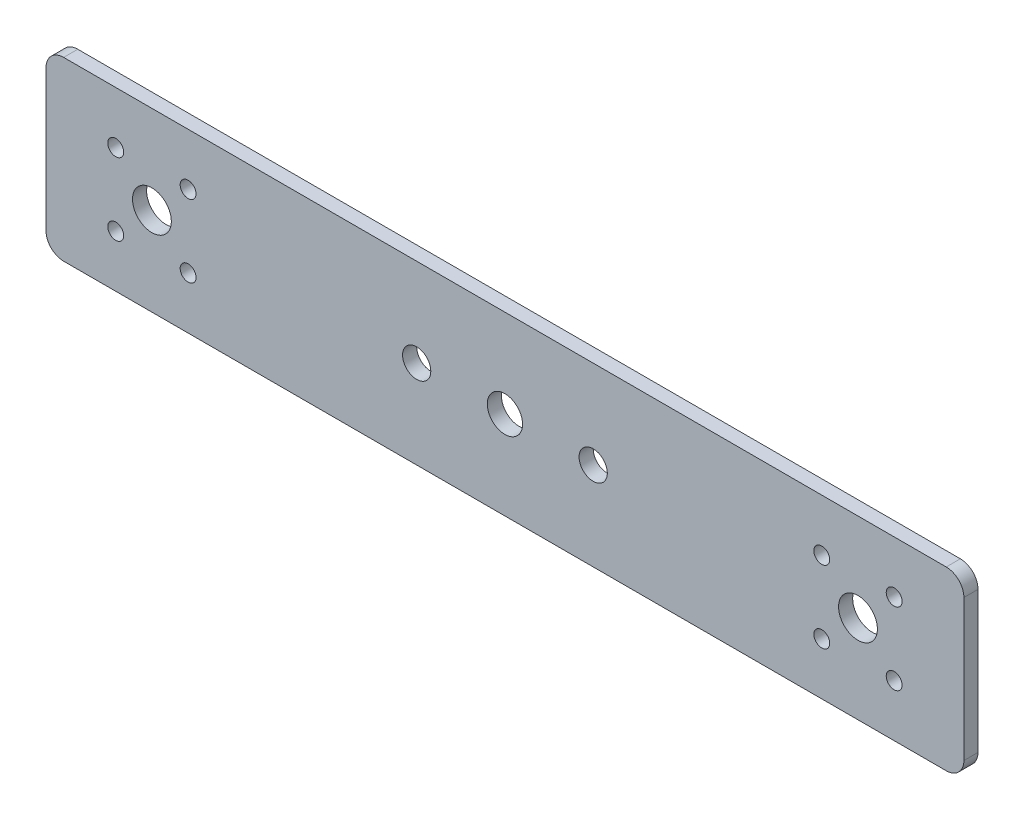
ISO-10303-21;
HEADER;
FILE_DESCRIPTION(('STEP AP214'),'2;1');
FILE_NAME('part.step','',(''),(''),'','','');
FILE_SCHEMA(('AUTOMOTIVE_DESIGN { 1 0 10303 214 1 1 1 1 }'));
ENDSEC;
DATA;
#1=APPLICATION_CONTEXT('core data for automotive mechanical design processes');
#2=APPLICATION_PROTOCOL_DEFINITION('international standard','automotive_design',2000,#1);
#3=PRODUCT_CONTEXT('',#1,'mechanical');
#4=PRODUCT('Part','Part','',(#3));
#5=PRODUCT_RELATED_PRODUCT_CATEGORY('part','',(#4));
#6=PRODUCT_DEFINITION_FORMATION('','',#4);
#7=PRODUCT_DEFINITION_CONTEXT('part definition',#1,'design');
#8=PRODUCT_DEFINITION('design','',#6,#7);
#9=PRODUCT_DEFINITION_SHAPE('','',#8);
#10=(LENGTH_UNIT() NAMED_UNIT(*) SI_UNIT(.MILLI.,.METRE.));
#11=(NAMED_UNIT(*) PLANE_ANGLE_UNIT() SI_UNIT($,.RADIAN.));
#12=(NAMED_UNIT(*) SI_UNIT($,.STERADIAN.) SOLID_ANGLE_UNIT());
#13=UNCERTAINTY_MEASURE_WITH_UNIT(LENGTH_MEASURE(1.E-05),#10,'distance_accuracy_value','');
#14=(GEOMETRIC_REPRESENTATION_CONTEXT(3) GLOBAL_UNCERTAINTY_ASSIGNED_CONTEXT((#13)) GLOBAL_UNIT_ASSIGNED_CONTEXT((#10,
#11,#12)) REPRESENTATION_CONTEXT('',''));
#15=CARTESIAN_POINT('',(0.,0.,0.));
#16=DIRECTION('',(0.,0.,1.));
#17=DIRECTION('',(1.,0.,0.));
#18=AXIS2_PLACEMENT_3D('',#15,#16,#17);
#19=CARTESIAN_POINT('',(130.,-25.,-4.));
#20=DIRECTION('',(1.,0.,0.));
#21=DIRECTION('',(0.,0.,-1.));
#22=AXIS2_PLACEMENT_3D('',#19,#20,#21);
#23=PLANE('',#22);
#24=DIRECTION('',(0.,1.,0.));
#25=VECTOR('',#24,1.);
#26=CARTESIAN_POINT('',(130.,-25.,0.));
#27=LINE('',#26,#25);
#28=CARTESIAN_POINT('',(130.,-20.,0.));
#29=VERTEX_POINT('',#28);
#30=CARTESIAN_POINT('',(130.,20.,0.));
#31=VERTEX_POINT('',#30);
#32=EDGE_CURVE('E166',#29,#31,#27,.T.);
#33=ORIENTED_EDGE('',*,*,#32,.F.);
#34=DIRECTION('',(0.,0.,1.));
#35=VECTOR('',#34,1.);
#36=CARTESIAN_POINT('',(130.,-20.,-4.));
#37=LINE('',#36,#35);
#38=CARTESIAN_POINT('',(130.,-20.,-4.));
#39=VERTEX_POINT('',#38);
#40=EDGE_CURVE('E155',#29,#39,#37,.F.);
#41=ORIENTED_EDGE('',*,*,#40,.T.);
#42=DIRECTION('',(0.,1.,0.));
#43=VECTOR('',#42,1.);
#44=CARTESIAN_POINT('',(130.,-25.,-4.));
#45=LINE('',#44,#43);
#46=CARTESIAN_POINT('',(130.,20.,-4.));
#47=VERTEX_POINT('',#46);
#48=EDGE_CURVE('E159',#39,#47,#45,.T.);
#49=ORIENTED_EDGE('',*,*,#48,.T.);
#50=DIRECTION('',(0.,0.,1.));
#51=VECTOR('',#50,1.);
#52=CARTESIAN_POINT('',(130.,20.,-4.));
#53=LINE('',#52,#51);
#54=EDGE_CURVE('E152',#47,#31,#53,.T.);
#55=ORIENTED_EDGE('',*,*,#54,.T.);
#56=EDGE_LOOP('',(#33,#41,#49,#55));
#57=FACE_BOUND('',#56,.T.);
#58=ADVANCED_FACE('F42',(#57),#23,.T.);
#59=CARTESIAN_POINT('',(-130.,-25.,-4.));
#60=DIRECTION('',(0.,-1.,0.));
#61=DIRECTION('',(0.,0.,-1.));
#62=AXIS2_PLACEMENT_3D('',#59,#60,#61);
#63=PLANE('',#62);
#64=DIRECTION('',(1.,0.,0.));
#65=VECTOR('',#64,1.);
#66=CARTESIAN_POINT('',(-130.,-25.,0.));
#67=LINE('',#66,#65);
#68=CARTESIAN_POINT('',(-125.,-25.,0.));
#69=VERTEX_POINT('',#68);
#70=CARTESIAN_POINT('',(125.,-25.,0.));
#71=VERTEX_POINT('',#70);
#72=EDGE_CURVE('E125',#69,#71,#67,.T.);
#73=ORIENTED_EDGE('',*,*,#72,.F.);
#74=DIRECTION('',(0.,0.,1.));
#75=VECTOR('',#74,1.);
#76=CARTESIAN_POINT('',(-125.,-25.,-4.));
#77=LINE('',#76,#75);
#78=CARTESIAN_POINT('',(-125.,-25.,-4.));
#79=VERTEX_POINT('',#78);
#80=EDGE_CURVE('E143',#69,#79,#77,.F.);
#81=ORIENTED_EDGE('',*,*,#80,.T.);
#82=DIRECTION('',(1.,0.,0.));
#83=VECTOR('',#82,1.);
#84=CARTESIAN_POINT('',(-130.,-25.,-4.));
#85=LINE('',#84,#83);
#86=CARTESIAN_POINT('',(125.,-25.,-4.));
#87=VERTEX_POINT('',#86);
#88=EDGE_CURVE('E127',#79,#87,#85,.T.);
#89=ORIENTED_EDGE('',*,*,#88,.T.);
#90=DIRECTION('',(0.,0.,1.));
#91=VECTOR('',#90,1.);
#92=CARTESIAN_POINT('',(125.,-25.,-4.));
#93=LINE('',#92,#91);
#94=EDGE_CURVE('E140',#87,#71,#93,.T.);
#95=ORIENTED_EDGE('',*,*,#94,.T.);
#96=EDGE_LOOP('',(#73,#81,#89,#95));
#97=FACE_BOUND('',#96,.T.);
#98=ADVANCED_FACE('F280',(#97),#63,.T.);
#99=CARTESIAN_POINT('',(-130.,-25.,-4.));
#100=DIRECTION('',(-1.,0.,0.));
#101=DIRECTION('',(0.,0.,1.));
#102=AXIS2_PLACEMENT_3D('',#99,#100,#101);
#103=PLANE('',#102);
#104=DIRECTION('',(0.,-1.,0.));
#105=VECTOR('',#104,1.);
#106=CARTESIAN_POINT('',(-130.,-25.,-4.));
#107=LINE('',#106,#105);
#108=CARTESIAN_POINT('',(-130.,20.,-4.));
#109=VERTEX_POINT('',#108);
#110=CARTESIAN_POINT('',(-130.,-20.,-4.));
#111=VERTEX_POINT('',#110);
#112=EDGE_CURVE('E131',#109,#111,#107,.T.);
#113=ORIENTED_EDGE('',*,*,#112,.T.);
#114=DIRECTION('',(0.,0.,1.));
#115=VECTOR('',#114,1.);
#116=CARTESIAN_POINT('',(-130.,-20.,-4.));
#117=LINE('',#116,#115);
#118=CARTESIAN_POINT('',(-130.,-20.,0.));
#119=VERTEX_POINT('',#118);
#120=EDGE_CURVE('E117',#111,#119,#117,.T.);
#121=ORIENTED_EDGE('',*,*,#120,.T.);
#122=DIRECTION('',(0.,-1.,0.));
#123=VECTOR('',#122,1.);
#124=CARTESIAN_POINT('',(-130.,-25.,0.));
#125=LINE('',#124,#123);
#126=CARTESIAN_POINT('',(-130.,20.,0.));
#127=VERTEX_POINT('',#126);
#128=EDGE_CURVE('E110',#127,#119,#125,.T.);
#129=ORIENTED_EDGE('',*,*,#128,.F.);
#130=DIRECTION('',(0.,0.,1.));
#131=VECTOR('',#130,1.);
#132=CARTESIAN_POINT('',(-130.,20.,-4.));
#133=LINE('',#132,#131);
#134=EDGE_CURVE('E123',#127,#109,#133,.F.);
#135=ORIENTED_EDGE('',*,*,#134,.T.);
#136=EDGE_LOOP('',(#113,#121,#129,#135));
#137=FACE_BOUND('',#136,.T.);
#138=ADVANCED_FACE('F122',(#137),#103,.T.);
#139=CARTESIAN_POINT('',(-130.,25.,-4.));
#140=DIRECTION('',(0.,1.,0.));
#141=DIRECTION('',(0.,0.,1.));
#142=AXIS2_PLACEMENT_3D('',#139,#140,#141);
#143=PLANE('',#142);
#144=DIRECTION('',(-1.,0.,0.));
#145=VECTOR('',#144,1.);
#146=CARTESIAN_POINT('',(-130.,25.,0.));
#147=LINE('',#146,#145);
#148=CARTESIAN_POINT('',(125.,25.,0.));
#149=VERTEX_POINT('',#148);
#150=CARTESIAN_POINT('',(-125.,25.,0.));
#151=VERTEX_POINT('',#150);
#152=EDGE_CURVE('E111',#149,#151,#147,.T.);
#153=ORIENTED_EDGE('',*,*,#152,.F.);
#154=DIRECTION('',(0.,0.,1.));
#155=VECTOR('',#154,1.);
#156=CARTESIAN_POINT('',(125.,25.,-4.));
#157=LINE('',#156,#155);
#158=CARTESIAN_POINT('',(125.,25.,-4.));
#159=VERTEX_POINT('',#158);
#160=EDGE_CURVE('E11',#149,#159,#157,.F.);
#161=ORIENTED_EDGE('',*,*,#160,.T.);
#162=DIRECTION('',(-1.,0.,0.));
#163=VECTOR('',#162,1.);
#164=CARTESIAN_POINT('',(-130.,25.,-4.));
#165=LINE('',#164,#163);
#166=CARTESIAN_POINT('',(-125.,25.,-4.));
#167=VERTEX_POINT('',#166);
#168=EDGE_CURVE('E157',#159,#167,#165,.T.);
#169=ORIENTED_EDGE('',*,*,#168,.T.);
#170=DIRECTION('',(0.,0.,1.));
#171=VECTOR('',#170,1.);
#172=CARTESIAN_POINT('',(-125.,25.,-4.));
#173=LINE('',#172,#171);
#174=EDGE_CURVE('E50',#167,#151,#173,.T.);
#175=ORIENTED_EDGE('',*,*,#174,.T.);
#176=EDGE_LOOP('',(#153,#161,#169,#175));
#177=FACE_BOUND('',#176,.T.);
#178=ADVANCED_FACE('F156',(#177),#143,.T.);
#179=CARTESIAN_POINT('',(0.,0.,-4.));
#180=DIRECTION('',(0.,0.,-1.));
#181=DIRECTION('',(-1.,0.,0.));
#182=AXIS2_PLACEMENT_3D('',#179,#180,#181);
#183=PLANE('',#182);
#184=CARTESIAN_POINT('',(25.,0.,-4.));
#185=DIRECTION('',(0.,0.,-1.));
#186=DIRECTION('',(-1.,0.,0.));
#187=AXIS2_PLACEMENT_3D('',#184,#185,#186);
#188=CIRCLE('',#187,4.);
#189=CARTESIAN_POINT('',(21.,0.,-4.));
#190=VERTEX_POINT('',#189);
#191=EDGE_CURVE('E169',#190,#190,#188,.T.);
#192=ORIENTED_EDGE('',*,*,#191,.F.);
#193=EDGE_LOOP('',(#192));
#194=FACE_BOUND('',#193,.T.);
#195=CARTESIAN_POINT('',(-25.,0.,-4.));
#196=DIRECTION('',(0.,0.,-1.));
#197=DIRECTION('',(-1.,0.,0.));
#198=AXIS2_PLACEMENT_3D('',#195,#196,#197);
#199=CIRCLE('',#198,4.);
#200=CARTESIAN_POINT('',(-29.,0.,-4.));
#201=VERTEX_POINT('',#200);
#202=EDGE_CURVE('E172',#201,#201,#199,.T.);
#203=ORIENTED_EDGE('',*,*,#202,.F.);
#204=EDGE_LOOP('',(#203));
#205=FACE_BOUND('',#204,.T.);
#206=CARTESIAN_POINT('',(0.,0.,-4.));
#207=DIRECTION('',(0.,0.,-1.));
#208=DIRECTION('',(-1.,0.,0.));
#209=AXIS2_PLACEMENT_3D('',#206,#207,#208);
#210=CIRCLE('',#209,5.);
#211=CARTESIAN_POINT('',(-5.,0.,-4.));
#212=VERTEX_POINT('',#211);
#213=EDGE_CURVE('E176',#212,#212,#210,.T.);
#214=ORIENTED_EDGE('',*,*,#213,.F.);
#215=EDGE_LOOP('',(#214));
#216=FACE_BOUND('',#215,.T.);
#217=CARTESIAN_POINT('',(-100.,0.,-4.));
#218=DIRECTION('',(0.,0.,-1.));
#219=DIRECTION('',(-1.,0.,0.));
#220=AXIS2_PLACEMENT_3D('',#217,#218,#219);
#221=CIRCLE('',#220,5.5);
#222=CARTESIAN_POINT('',(-105.5,0.,-4.));
#223=VERTEX_POINT('',#222);
#224=EDGE_CURVE('E181',#223,#223,#221,.T.);
#225=ORIENTED_EDGE('',*,*,#224,.F.);
#226=EDGE_LOOP('',(#225));
#227=FACE_BOUND('',#226,.T.);
#228=CARTESIAN_POINT('',(110.253048327207,10.253048327205,-4.));
#229=DIRECTION('',(0.,0.,-1.));
#230=DIRECTION('',(-1.,0.,0.));
#231=AXIS2_PLACEMENT_3D('',#228,#229,#230);
#232=CIRCLE('',#231,2.25);
#233=CARTESIAN_POINT('',(108.003048327207,10.253048327205,-4.));
#234=VERTEX_POINT('',#233);
#235=EDGE_CURVE('E184',#234,#234,#232,.T.);
#236=ORIENTED_EDGE('',*,*,#235,.F.);
#237=EDGE_LOOP('',(#236));
#238=FACE_BOUND('',#237,.T.);
#239=CARTESIAN_POINT('',(89.7469516727988,10.253048327205,-4.));
#240=DIRECTION('',(0.,0.,-1.));
#241=DIRECTION('',(-1.,0.,0.));
#242=AXIS2_PLACEMENT_3D('',#239,#240,#241);
#243=CIRCLE('',#242,2.25);
#244=CARTESIAN_POINT('',(87.4969516727988,10.253048327205,-4.));
#245=VERTEX_POINT('',#244);
#246=EDGE_CURVE('E187',#245,#245,#243,.T.);
#247=ORIENTED_EDGE('',*,*,#246,.F.);
#248=EDGE_LOOP('',(#247));
#249=FACE_BOUND('',#248,.T.);
#250=CARTESIAN_POINT('',(89.7469516727988,-10.2530483272049,-4.));
#251=DIRECTION('',(0.,0.,-1.));
#252=DIRECTION('',(-1.,0.,0.));
#253=AXIS2_PLACEMENT_3D('',#250,#251,#252);
#254=CIRCLE('',#253,2.25);
#255=CARTESIAN_POINT('',(87.4969516727988,-10.2530483272049,-4.));
#256=VERTEX_POINT('',#255);
#257=EDGE_CURVE('E190',#256,#256,#254,.T.);
#258=ORIENTED_EDGE('',*,*,#257,.F.);
#259=EDGE_LOOP('',(#258));
#260=FACE_BOUND('',#259,.T.);
#261=CARTESIAN_POINT('',(110.253048327207,-10.2530483272049,-4.));
#262=DIRECTION('',(0.,0.,-1.));
#263=DIRECTION('',(-1.,0.,0.));
#264=AXIS2_PLACEMENT_3D('',#261,#262,#263);
#265=CIRCLE('',#264,2.25);
#266=CARTESIAN_POINT('',(108.003048327207,-10.2530483272049,-4.));
#267=VERTEX_POINT('',#266);
#268=EDGE_CURVE('E193',#267,#267,#265,.T.);
#269=ORIENTED_EDGE('',*,*,#268,.F.);
#270=EDGE_LOOP('',(#269));
#271=FACE_BOUND('',#270,.T.);
#272=CARTESIAN_POINT('',(-110.253048327209,-10.2530483272049,-4.));
#273=DIRECTION('',(0.,0.,-1.));
#274=DIRECTION('',(-1.,0.,0.));
#275=AXIS2_PLACEMENT_3D('',#272,#273,#274);
#276=CIRCLE('',#275,2.25);
#277=CARTESIAN_POINT('',(-112.503048327209,-10.2530483272049,-4.));
#278=VERTEX_POINT('',#277);
#279=EDGE_CURVE('E196',#278,#278,#276,.T.);
#280=ORIENTED_EDGE('',*,*,#279,.F.);
#281=EDGE_LOOP('',(#280));
#282=FACE_BOUND('',#281,.T.);
#283=CARTESIAN_POINT('',(-89.7469516728003,-10.2530483272049,-4.));
#284=DIRECTION('',(0.,0.,-1.));
#285=DIRECTION('',(-1.,0.,0.));
#286=AXIS2_PLACEMENT_3D('',#283,#284,#285);
#287=CIRCLE('',#286,2.25);
#288=CARTESIAN_POINT('',(-91.9969516728003,-10.2530483272049,-4.));
#289=VERTEX_POINT('',#288);
#290=EDGE_CURVE('E199',#289,#289,#287,.T.);
#291=ORIENTED_EDGE('',*,*,#290,.F.);
#292=EDGE_LOOP('',(#291));
#293=FACE_BOUND('',#292,.T.);
#294=CARTESIAN_POINT('',(-89.7469516728003,10.2530483272051,-4.));
#295=DIRECTION('',(0.,0.,-1.));
#296=DIRECTION('',(-1.,0.,0.));
#297=AXIS2_PLACEMENT_3D('',#294,#295,#296);
#298=CIRCLE('',#297,2.25);
#299=CARTESIAN_POINT('',(-91.9969516728003,10.2530483272051,-4.));
#300=VERTEX_POINT('',#299);
#301=EDGE_CURVE('E202',#300,#300,#298,.T.);
#302=ORIENTED_EDGE('',*,*,#301,.F.);
#303=EDGE_LOOP('',(#302));
#304=FACE_BOUND('',#303,.T.);
#305=CARTESIAN_POINT('',(-110.253048327209,10.2530483272051,-4.));
#306=DIRECTION('',(0.,0.,-1.));
#307=DIRECTION('',(-1.,0.,0.));
#308=AXIS2_PLACEMENT_3D('',#305,#306,#307);
#309=CIRCLE('',#308,2.25);
#310=CARTESIAN_POINT('',(-112.503048327209,10.2530483272051,-4.));
#311=VERTEX_POINT('',#310);
#312=EDGE_CURVE('E205',#311,#311,#309,.T.);
#313=ORIENTED_EDGE('',*,*,#312,.F.);
#314=EDGE_LOOP('',(#313));
#315=FACE_BOUND('',#314,.T.);
#316=CARTESIAN_POINT('',(100.,0.,-4.));
#317=DIRECTION('',(0.,0.,-1.));
#318=DIRECTION('',(-1.,0.,0.));
#319=AXIS2_PLACEMENT_3D('',#316,#317,#318);
#320=CIRCLE('',#319,5.5);
#321=CARTESIAN_POINT('',(94.5,0.,-4.));
#322=VERTEX_POINT('',#321);
#323=EDGE_CURVE('E208',#322,#322,#320,.T.);
#324=ORIENTED_EDGE('',*,*,#323,.F.);
#325=EDGE_LOOP('',(#324));
#326=FACE_BOUND('',#325,.T.);
#327=ORIENTED_EDGE('',*,*,#88,.F.);
#328=CARTESIAN_POINT('',(-125.,-20.,-4.));
#329=DIRECTION('',(0.,0.,-1.));
#330=DIRECTION('',(-1.,0.,0.));
#331=AXIS2_PLACEMENT_3D('',#328,#329,#330);
#332=CIRCLE('',#331,5.);
#333=EDGE_CURVE('E150',#79,#111,#332,.T.);
#334=ORIENTED_EDGE('',*,*,#333,.T.);
#335=ORIENTED_EDGE('',*,*,#112,.F.);
#336=CARTESIAN_POINT('',(-125.,20.,-4.));
#337=DIRECTION('',(0.,0.,-1.));
#338=DIRECTION('',(-1.,0.,0.));
#339=AXIS2_PLACEMENT_3D('',#336,#337,#338);
#340=CIRCLE('',#339,5.);
#341=EDGE_CURVE('E57',#109,#167,#340,.T.);
#342=ORIENTED_EDGE('',*,*,#341,.T.);
#343=ORIENTED_EDGE('',*,*,#168,.F.);
#344=CARTESIAN_POINT('',(125.,20.,-4.));
#345=DIRECTION('',(0.,0.,-1.));
#346=DIRECTION('',(-1.,0.,0.));
#347=AXIS2_PLACEMENT_3D('',#344,#345,#346);
#348=CIRCLE('',#347,5.);
#349=EDGE_CURVE('E146',#159,#47,#348,.T.);
#350=ORIENTED_EDGE('',*,*,#349,.T.);
#351=ORIENTED_EDGE('',*,*,#48,.F.);
#352=CARTESIAN_POINT('',(125.,-20.,-4.));
#353=DIRECTION('',(0.,0.,-1.));
#354=DIRECTION('',(-1.,0.,0.));
#355=AXIS2_PLACEMENT_3D('',#352,#353,#354);
#356=CIRCLE('',#355,5.);
#357=EDGE_CURVE('E148',#39,#87,#356,.T.);
#358=ORIENTED_EDGE('',*,*,#357,.T.);
#359=EDGE_LOOP('',(#327,#334,#335,#342,#343,#350,#351,#358));
#360=FACE_BOUND('',#359,.T.);
#361=ADVANCED_FACE('F256',(#194,#205,#216,#227,#238,#249,#260,#271,#282,#293,#304,#315,#326,
#360),#183,.T.);
#362=CARTESIAN_POINT('',(0.,0.,0.));
#363=DIRECTION('',(0.,0.,-1.));
#364=DIRECTION('',(-1.,0.,0.));
#365=AXIS2_PLACEMENT_3D('',#362,#363,#364);
#366=PLANE('',#365);
#367=CARTESIAN_POINT('',(25.,0.,0.));
#368=DIRECTION('',(0.,0.,1.));
#369=DIRECTION('',(-1.,0.,0.));
#370=AXIS2_PLACEMENT_3D('',#367,#368,#369);
#371=CIRCLE('',#370,4.);
#372=CARTESIAN_POINT('',(21.,0.,0.));
#373=VERTEX_POINT('',#372);
#374=EDGE_CURVE('E228',#373,#373,#371,.T.);
#375=ORIENTED_EDGE('',*,*,#374,.F.);
#376=EDGE_LOOP('',(#375));
#377=FACE_BOUND('',#376,.T.);
#378=CARTESIAN_POINT('',(-25.,0.,0.));
#379=DIRECTION('',(0.,0.,1.));
#380=DIRECTION('',(1.,0.,0.));
#381=AXIS2_PLACEMENT_3D('',#378,#379,#380);
#382=CIRCLE('',#381,4.);
#383=CARTESIAN_POINT('',(-21.,0.,0.));
#384=VERTEX_POINT('',#383);
#385=EDGE_CURVE('E232',#384,#384,#382,.T.);
#386=ORIENTED_EDGE('',*,*,#385,.F.);
#387=EDGE_LOOP('',(#386));
#388=FACE_BOUND('',#387,.T.);
#389=CARTESIAN_POINT('',(0.,0.,0.));
#390=DIRECTION('',(0.,0.,1.));
#391=DIRECTION('',(1.,0.,0.));
#392=AXIS2_PLACEMENT_3D('',#389,#390,#391);
#393=CIRCLE('',#392,5.);
#394=CARTESIAN_POINT('',(5.,0.,0.));
#395=VERTEX_POINT('',#394);
#396=EDGE_CURVE('E229',#395,#395,#393,.T.);
#397=ORIENTED_EDGE('',*,*,#396,.F.);
#398=EDGE_LOOP('',(#397));
#399=FACE_BOUND('',#398,.T.);
#400=CARTESIAN_POINT('',(-100.,0.,0.));
#401=DIRECTION('',(0.,0.,1.));
#402=DIRECTION('',(1.,0.,0.));
#403=AXIS2_PLACEMENT_3D('',#400,#401,#402);
#404=CIRCLE('',#403,5.5);
#405=CARTESIAN_POINT('',(-94.5,0.,0.));
#406=VERTEX_POINT('',#405);
#407=EDGE_CURVE('E214',#406,#406,#404,.T.);
#408=ORIENTED_EDGE('',*,*,#407,.F.);
#409=EDGE_LOOP('',(#408));
#410=FACE_BOUND('',#409,.T.);
#411=CARTESIAN_POINT('',(110.253048327207,10.253048327205,0.));
#412=DIRECTION('',(0.,0.,1.));
#413=DIRECTION('',(1.,0.,0.));
#414=AXIS2_PLACEMENT_3D('',#411,#412,#413);
#415=CIRCLE('',#414,2.25);
#416=CARTESIAN_POINT('',(112.503048327207,10.253048327205,0.));
#417=VERTEX_POINT('',#416);
#418=EDGE_CURVE('E225',#417,#417,#415,.T.);
#419=ORIENTED_EDGE('',*,*,#418,.F.);
#420=EDGE_LOOP('',(#419));
#421=FACE_BOUND('',#420,.T.);
#422=CARTESIAN_POINT('',(89.7469516727988,10.253048327205,0.));
#423=DIRECTION('',(0.,0.,1.));
#424=DIRECTION('',(-1.,0.,0.));
#425=AXIS2_PLACEMENT_3D('',#422,#423,#424);
#426=CIRCLE('',#425,2.25);
#427=CARTESIAN_POINT('',(87.4969516727988,10.253048327205,0.));
#428=VERTEX_POINT('',#427);
#429=EDGE_CURVE('E222',#428,#428,#426,.T.);
#430=ORIENTED_EDGE('',*,*,#429,.F.);
#431=EDGE_LOOP('',(#430));
#432=FACE_BOUND('',#431,.T.);
#433=CARTESIAN_POINT('',(89.7469516727988,-10.2530483272049,0.));
#434=DIRECTION('',(0.,0.,1.));
#435=DIRECTION('',(1.,0.,0.));
#436=AXIS2_PLACEMENT_3D('',#433,#434,#435);
#437=CIRCLE('',#436,2.25);
#438=CARTESIAN_POINT('',(91.9969516727988,-10.2530483272049,0.));
#439=VERTEX_POINT('',#438);
#440=EDGE_CURVE('E218',#439,#439,#437,.T.);
#441=ORIENTED_EDGE('',*,*,#440,.F.);
#442=EDGE_LOOP('',(#441));
#443=FACE_BOUND('',#442,.T.);
#444=CARTESIAN_POINT('',(110.253048327207,-10.2530483272049,0.));
#445=DIRECTION('',(0.,0.,1.));
#446=DIRECTION('',(-1.,0.,0.));
#447=AXIS2_PLACEMENT_3D('',#444,#445,#446);
#448=CIRCLE('',#447,2.25);
#449=CARTESIAN_POINT('',(108.003048327207,-10.2530483272049,0.));
#450=VERTEX_POINT('',#449);
#451=EDGE_CURVE('E215',#450,#450,#448,.T.);
#452=ORIENTED_EDGE('',*,*,#451,.F.);
#453=EDGE_LOOP('',(#452));
#454=FACE_BOUND('',#453,.T.);
#455=CARTESIAN_POINT('',(-110.253048327209,-10.2530483272049,0.));
#456=DIRECTION('',(0.,0.,1.));
#457=DIRECTION('',(1.,0.,0.));
#458=AXIS2_PLACEMENT_3D('',#455,#456,#457);
#459=CIRCLE('',#458,2.25);
#460=CARTESIAN_POINT('',(-108.003048327209,-10.2530483272049,0.));
#461=VERTEX_POINT('',#460);
#462=EDGE_CURVE('E219',#461,#461,#459,.T.);
#463=ORIENTED_EDGE('',*,*,#462,.F.);
#464=EDGE_LOOP('',(#463));
#465=FACE_BOUND('',#464,.T.);
#466=CARTESIAN_POINT('',(-89.7469516728003,-10.2530483272049,0.));
#467=DIRECTION('',(0.,0.,1.));
#468=DIRECTION('',(-1.,0.,0.));
#469=AXIS2_PLACEMENT_3D('',#466,#467,#468);
#470=CIRCLE('',#469,2.25);
#471=CARTESIAN_POINT('',(-91.9969516728003,-10.2530483272049,0.));
#472=VERTEX_POINT('',#471);
#473=EDGE_CURVE('E245',#472,#472,#470,.T.);
#474=ORIENTED_EDGE('',*,*,#473,.F.);
#475=EDGE_LOOP('',(#474));
#476=FACE_BOUND('',#475,.T.);
#477=CARTESIAN_POINT('',(-89.7469516728003,10.2530483272051,0.));
#478=DIRECTION('',(0.,0.,1.));
#479=DIRECTION('',(1.,0.,0.));
#480=AXIS2_PLACEMENT_3D('',#477,#478,#479);
#481=CIRCLE('',#480,2.25);
#482=CARTESIAN_POINT('',(-87.4969516728003,10.2530483272051,0.));
#483=VERTEX_POINT('',#482);
#484=EDGE_CURVE('E242',#483,#483,#481,.T.);
#485=ORIENTED_EDGE('',*,*,#484,.F.);
#486=EDGE_LOOP('',(#485));
#487=FACE_BOUND('',#486,.T.);
#488=CARTESIAN_POINT('',(-110.253048327209,10.2530483272051,0.));
#489=DIRECTION('',(0.,0.,1.));
#490=DIRECTION('',(-1.,0.,0.));
#491=AXIS2_PLACEMENT_3D('',#488,#489,#490);
#492=CIRCLE('',#491,2.25);
#493=CARTESIAN_POINT('',(-112.503048327209,10.2530483272051,0.));
#494=VERTEX_POINT('',#493);
#495=EDGE_CURVE('E239',#494,#494,#492,.T.);
#496=ORIENTED_EDGE('',*,*,#495,.F.);
#497=EDGE_LOOP('',(#496));
#498=FACE_BOUND('',#497,.T.);
#499=CARTESIAN_POINT('',(100.,0.,0.));
#500=DIRECTION('',(0.,0.,1.));
#501=DIRECTION('',(1.,0.,0.));
#502=AXIS2_PLACEMENT_3D('',#499,#500,#501);
#503=CIRCLE('',#502,5.5);
#504=CARTESIAN_POINT('',(105.5,0.,0.));
#505=VERTEX_POINT('',#504);
#506=EDGE_CURVE('E211',#505,#505,#503,.T.);
#507=ORIENTED_EDGE('',*,*,#506,.F.);
#508=EDGE_LOOP('',(#507));
#509=FACE_BOUND('',#508,.T.);
#510=ORIENTED_EDGE('',*,*,#128,.T.);
#511=CARTESIAN_POINT('',(-125.,-20.,0.));
#512=DIRECTION('',(0.,0.,-1.));
#513=DIRECTION('',(-1.,0.,0.));
#514=AXIS2_PLACEMENT_3D('',#511,#512,#513);
#515=CIRCLE('',#514,5.);
#516=EDGE_CURVE('E138',#119,#69,#515,.F.);
#517=ORIENTED_EDGE('',*,*,#516,.T.);
#518=ORIENTED_EDGE('',*,*,#72,.T.);
#519=CARTESIAN_POINT('',(125.,-20.,0.));
#520=DIRECTION('',(0.,0.,-1.));
#521=DIRECTION('',(-1.,0.,0.));
#522=AXIS2_PLACEMENT_3D('',#519,#520,#521);
#523=CIRCLE('',#522,5.);
#524=EDGE_CURVE('E136',#71,#29,#523,.F.);
#525=ORIENTED_EDGE('',*,*,#524,.T.);
#526=ORIENTED_EDGE('',*,*,#32,.T.);
#527=CARTESIAN_POINT('',(125.,20.,0.));
#528=DIRECTION('',(0.,0.,-1.));
#529=DIRECTION('',(-1.,0.,0.));
#530=AXIS2_PLACEMENT_3D('',#527,#528,#529);
#531=CIRCLE('',#530,5.);
#532=EDGE_CURVE('E116',#31,#149,#531,.F.);
#533=ORIENTED_EDGE('',*,*,#532,.T.);
#534=ORIENTED_EDGE('',*,*,#152,.T.);
#535=CARTESIAN_POINT('',(-125.,20.,0.));
#536=DIRECTION('',(0.,0.,-1.));
#537=DIRECTION('',(-1.,0.,0.));
#538=AXIS2_PLACEMENT_3D('',#535,#536,#537);
#539=CIRCLE('',#538,5.);
#540=EDGE_CURVE('E107',#151,#127,#539,.F.);
#541=ORIENTED_EDGE('',*,*,#540,.T.);
#542=EDGE_LOOP('',(#510,#517,#518,#525,#526,#533,#534,#541));
#543=FACE_BOUND('',#542,.T.);
#544=ADVANCED_FACE('F109',(#377,#388,#399,#410,#421,#432,#443,#454,#465,#476,#487,#498,#509,
#543),#366,.F.);
#545=CARTESIAN_POINT('',(100.,0.,-10.));
#546=DIRECTION('',(0.,0.,1.));
#547=DIRECTION('',(1.,0.,0.));
#548=AXIS2_PLACEMENT_3D('',#545,#546,#547);
#549=CYLINDRICAL_SURFACE('',#548,5.5);
#550=ORIENTED_EDGE('',*,*,#323,.T.);
#551=EDGE_LOOP('',(#550));
#552=FACE_BOUND('',#551,.T.);
#553=ORIENTED_EDGE('',*,*,#506,.T.);
#554=EDGE_LOOP('',(#553));
#555=FACE_BOUND('',#554,.T.);
#556=ADVANCED_FACE('F255',(#552,#555),#549,.F.);
#557=CARTESIAN_POINT('',(-110.253048327209,10.2530483272051,-10.));
#558=DIRECTION('',(0.,0.,1.));
#559=DIRECTION('',(1.,0.,0.));
#560=AXIS2_PLACEMENT_3D('',#557,#558,#559);
#561=CYLINDRICAL_SURFACE('',#560,2.25);
#562=ORIENTED_EDGE('',*,*,#312,.T.);
#563=EDGE_LOOP('',(#562));
#564=FACE_BOUND('',#563,.T.);
#565=ORIENTED_EDGE('',*,*,#495,.T.);
#566=EDGE_LOOP('',(#565));
#567=FACE_BOUND('',#566,.T.);
#568=ADVANCED_FACE('F268',(#564,#567),#561,.F.);
#569=CARTESIAN_POINT('',(-89.7469516728003,10.2530483272051,-10.));
#570=DIRECTION('',(0.,0.,1.));
#571=DIRECTION('',(1.,0.,0.));
#572=AXIS2_PLACEMENT_3D('',#569,#570,#571);
#573=CYLINDRICAL_SURFACE('',#572,2.25);
#574=ORIENTED_EDGE('',*,*,#301,.T.);
#575=EDGE_LOOP('',(#574));
#576=FACE_BOUND('',#575,.T.);
#577=ORIENTED_EDGE('',*,*,#484,.T.);
#578=EDGE_LOOP('',(#577));
#579=FACE_BOUND('',#578,.T.);
#580=ADVANCED_FACE('F274',(#576,#579),#573,.F.);
#581=CARTESIAN_POINT('',(-89.7469516728003,-10.2530483272049,-10.));
#582=DIRECTION('',(0.,0.,1.));
#583=DIRECTION('',(1.,0.,0.));
#584=AXIS2_PLACEMENT_3D('',#581,#582,#583);
#585=CYLINDRICAL_SURFACE('',#584,2.25);
#586=ORIENTED_EDGE('',*,*,#290,.T.);
#587=EDGE_LOOP('',(#586));
#588=FACE_BOUND('',#587,.T.);
#589=ORIENTED_EDGE('',*,*,#473,.T.);
#590=EDGE_LOOP('',(#589));
#591=FACE_BOUND('',#590,.T.);
#592=ADVANCED_FACE('F435',(#588,#591),#585,.F.);
#593=CARTESIAN_POINT('',(-110.253048327209,-10.2530483272049,-10.));
#594=DIRECTION('',(0.,0.,1.));
#595=DIRECTION('',(1.,0.,0.));
#596=AXIS2_PLACEMENT_3D('',#593,#594,#595);
#597=CYLINDRICAL_SURFACE('',#596,2.25);
#598=ORIENTED_EDGE('',*,*,#279,.T.);
#599=EDGE_LOOP('',(#598));
#600=FACE_BOUND('',#599,.T.);
#601=ORIENTED_EDGE('',*,*,#462,.T.);
#602=EDGE_LOOP('',(#601));
#603=FACE_BOUND('',#602,.T.);
#604=ADVANCED_FACE('F251',(#600,#603),#597,.F.);
#605=CARTESIAN_POINT('',(110.253048327207,-10.2530483272049,-10.));
#606=DIRECTION('',(0.,0.,1.));
#607=DIRECTION('',(1.,0.,0.));
#608=AXIS2_PLACEMENT_3D('',#605,#606,#607);
#609=CYLINDRICAL_SURFACE('',#608,2.25);
#610=ORIENTED_EDGE('',*,*,#268,.T.);
#611=EDGE_LOOP('',(#610));
#612=FACE_BOUND('',#611,.T.);
#613=ORIENTED_EDGE('',*,*,#451,.T.);
#614=EDGE_LOOP('',(#613));
#615=FACE_BOUND('',#614,.T.);
#616=ADVANCED_FACE('F421',(#612,#615),#609,.F.);
#617=CARTESIAN_POINT('',(89.7469516727988,-10.2530483272049,-10.));
#618=DIRECTION('',(0.,0.,1.));
#619=DIRECTION('',(1.,0.,0.));
#620=AXIS2_PLACEMENT_3D('',#617,#618,#619);
#621=CYLINDRICAL_SURFACE('',#620,2.25);
#622=ORIENTED_EDGE('',*,*,#257,.T.);
#623=EDGE_LOOP('',(#622));
#624=FACE_BOUND('',#623,.T.);
#625=ORIENTED_EDGE('',*,*,#440,.T.);
#626=EDGE_LOOP('',(#625));
#627=FACE_BOUND('',#626,.T.);
#628=ADVANCED_FACE('F413',(#624,#627),#621,.F.);
#629=CARTESIAN_POINT('',(89.7469516727988,10.253048327205,-10.));
#630=DIRECTION('',(0.,0.,1.));
#631=DIRECTION('',(1.,0.,0.));
#632=AXIS2_PLACEMENT_3D('',#629,#630,#631);
#633=CYLINDRICAL_SURFACE('',#632,2.25);
#634=ORIENTED_EDGE('',*,*,#246,.T.);
#635=EDGE_LOOP('',(#634));
#636=FACE_BOUND('',#635,.T.);
#637=ORIENTED_EDGE('',*,*,#429,.T.);
#638=EDGE_LOOP('',(#637));
#639=FACE_BOUND('',#638,.T.);
#640=ADVANCED_FACE('F405',(#636,#639),#633,.F.);
#641=CARTESIAN_POINT('',(110.253048327207,10.253048327205,-10.));
#642=DIRECTION('',(0.,0.,1.));
#643=DIRECTION('',(1.,0.,0.));
#644=AXIS2_PLACEMENT_3D('',#641,#642,#643);
#645=CYLINDRICAL_SURFACE('',#644,2.25);
#646=ORIENTED_EDGE('',*,*,#235,.T.);
#647=EDGE_LOOP('',(#646));
#648=FACE_BOUND('',#647,.T.);
#649=ORIENTED_EDGE('',*,*,#418,.T.);
#650=EDGE_LOOP('',(#649));
#651=FACE_BOUND('',#650,.T.);
#652=ADVANCED_FACE('F397',(#648,#651),#645,.F.);
#653=CARTESIAN_POINT('',(-100.,0.,-10.));
#654=DIRECTION('',(0.,0.,1.));
#655=DIRECTION('',(1.,0.,0.));
#656=AXIS2_PLACEMENT_3D('',#653,#654,#655);
#657=CYLINDRICAL_SURFACE('',#656,5.5);
#658=ORIENTED_EDGE('',*,*,#224,.T.);
#659=EDGE_LOOP('',(#658));
#660=FACE_BOUND('',#659,.T.);
#661=ORIENTED_EDGE('',*,*,#407,.T.);
#662=EDGE_LOOP('',(#661));
#663=FACE_BOUND('',#662,.T.);
#664=ADVANCED_FACE('F389',(#660,#663),#657,.F.);
#665=CARTESIAN_POINT('',(0.,0.,-10.));
#666=DIRECTION('',(0.,0.,1.));
#667=DIRECTION('',(1.,0.,0.));
#668=AXIS2_PLACEMENT_3D('',#665,#666,#667);
#669=CYLINDRICAL_SURFACE('',#668,5.);
#670=ORIENTED_EDGE('',*,*,#213,.T.);
#671=EDGE_LOOP('',(#670));
#672=FACE_BOUND('',#671,.T.);
#673=ORIENTED_EDGE('',*,*,#396,.T.);
#674=EDGE_LOOP('',(#673));
#675=FACE_BOUND('',#674,.T.);
#676=ADVANCED_FACE('F381',(#672,#675),#669,.F.);
#677=CARTESIAN_POINT('',(-25.,0.,-10.));
#678=DIRECTION('',(0.,0.,1.));
#679=DIRECTION('',(1.,0.,0.));
#680=AXIS2_PLACEMENT_3D('',#677,#678,#679);
#681=CYLINDRICAL_SURFACE('',#680,4.);
#682=ORIENTED_EDGE('',*,*,#202,.T.);
#683=EDGE_LOOP('',(#682));
#684=FACE_BOUND('',#683,.T.);
#685=ORIENTED_EDGE('',*,*,#385,.T.);
#686=EDGE_LOOP('',(#685));
#687=FACE_BOUND('',#686,.T.);
#688=ADVANCED_FACE('F375',(#684,#687),#681,.F.);
#689=CARTESIAN_POINT('',(25.,0.,-10.));
#690=DIRECTION('',(0.,0.,1.));
#691=DIRECTION('',(1.,0.,0.));
#692=AXIS2_PLACEMENT_3D('',#689,#690,#691);
#693=CYLINDRICAL_SURFACE('',#692,4.);
#694=ORIENTED_EDGE('',*,*,#191,.T.);
#695=EDGE_LOOP('',(#694));
#696=FACE_BOUND('',#695,.T.);
#697=ORIENTED_EDGE('',*,*,#374,.T.);
#698=EDGE_LOOP('',(#697));
#699=FACE_BOUND('',#698,.T.);
#700=ADVANCED_FACE('F295',(#696,#699),#693,.F.);
#701=CARTESIAN_POINT('',(-125.,-20.,-4.));
#702=DIRECTION('',(0.,0.,1.));
#703=DIRECTION('',(1.,0.,0.));
#704=AXIS2_PLACEMENT_3D('',#701,#702,#703);
#705=CYLINDRICAL_SURFACE('',#704,5.);
#706=ORIENTED_EDGE('',*,*,#333,.F.);
#707=ORIENTED_EDGE('',*,*,#80,.F.);
#708=ORIENTED_EDGE('',*,*,#516,.F.);
#709=ORIENTED_EDGE('',*,*,#120,.F.);
#710=EDGE_LOOP('',(#706,#707,#708,#709));
#711=FACE_BOUND('',#710,.T.);
#712=ADVANCED_FACE('F291',(#711),#705,.T.);
#713=CARTESIAN_POINT('',(125.,-20.,-4.));
#714=DIRECTION('',(0.,0.,1.));
#715=DIRECTION('',(1.,0.,0.));
#716=AXIS2_PLACEMENT_3D('',#713,#714,#715);
#717=CYLINDRICAL_SURFACE('',#716,5.);
#718=ORIENTED_EDGE('',*,*,#357,.F.);
#719=ORIENTED_EDGE('',*,*,#40,.F.);
#720=ORIENTED_EDGE('',*,*,#524,.F.);
#721=ORIENTED_EDGE('',*,*,#94,.F.);
#722=EDGE_LOOP('',(#718,#719,#720,#721));
#723=FACE_BOUND('',#722,.T.);
#724=ADVANCED_FACE('F294',(#723),#717,.T.);
#725=CARTESIAN_POINT('',(125.,20.,-4.));
#726=DIRECTION('',(0.,0.,1.));
#727=DIRECTION('',(1.,0.,0.));
#728=AXIS2_PLACEMENT_3D('',#725,#726,#727);
#729=CYLINDRICAL_SURFACE('',#728,5.);
#730=ORIENTED_EDGE('',*,*,#349,.F.);
#731=ORIENTED_EDGE('',*,*,#160,.F.);
#732=ORIENTED_EDGE('',*,*,#532,.F.);
#733=ORIENTED_EDGE('',*,*,#54,.F.);
#734=EDGE_LOOP('',(#730,#731,#732,#733));
#735=FACE_BOUND('',#734,.T.);
#736=ADVANCED_FACE('F298',(#735),#729,.T.);
#737=CARTESIAN_POINT('',(-125.,20.,-4.));
#738=DIRECTION('',(0.,0.,1.));
#739=DIRECTION('',(1.,0.,0.));
#740=AXIS2_PLACEMENT_3D('',#737,#738,#739);
#741=CYLINDRICAL_SURFACE('',#740,5.);
#742=ORIENTED_EDGE('',*,*,#341,.F.);
#743=ORIENTED_EDGE('',*,*,#134,.F.);
#744=ORIENTED_EDGE('',*,*,#540,.F.);
#745=ORIENTED_EDGE('',*,*,#174,.F.);
#746=EDGE_LOOP('',(#742,#743,#744,#745));
#747=FACE_BOUND('',#746,.T.);
#748=ADVANCED_FACE('F44',(#747),#741,.T.);
#749=CLOSED_SHELL('',(#58,#98,#138,#178,#361,#544,#556,#568,#580,#592,#604,#616,#628,#640,#652,
#664,#676,#688,#700,#712,#724,#736,#748));
#750=MANIFOLD_SOLID_BREP('B2',#749);
#751=ADVANCED_BREP_SHAPE_REPRESENTATION('',(#18,#750),#14);
#752=SHAPE_DEFINITION_REPRESENTATION(#9,#751);
ENDSEC;
END-ISO-10303-21;
